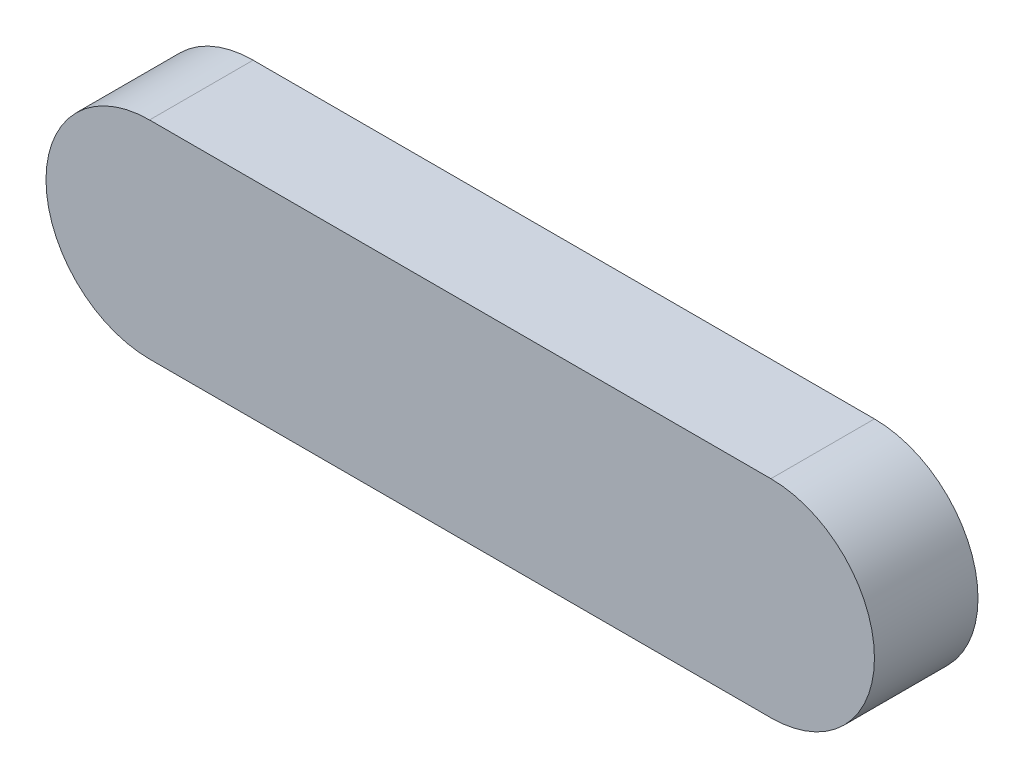
ISO-10303-21;
HEADER;
FILE_DESCRIPTION(('STEP AP214'),'2;1');
FILE_NAME('part.step','',(''),(''),'','','');
FILE_SCHEMA(('AUTOMOTIVE_DESIGN { 1 0 10303 214 1 1 1 1 }'));
ENDSEC;
DATA;
#1=APPLICATION_CONTEXT('core data for automotive mechanical design processes');
#2=APPLICATION_PROTOCOL_DEFINITION('international standard','automotive_design',2000,#1);
#3=PRODUCT_CONTEXT('',#1,'mechanical');
#4=PRODUCT('Part','Part','',(#3));
#5=PRODUCT_RELATED_PRODUCT_CATEGORY('part','',(#4));
#6=PRODUCT_DEFINITION_FORMATION('','',#4);
#7=PRODUCT_DEFINITION_CONTEXT('part definition',#1,'design');
#8=PRODUCT_DEFINITION('design','',#6,#7);
#9=PRODUCT_DEFINITION_SHAPE('','',#8);
#10=(LENGTH_UNIT() NAMED_UNIT(*) SI_UNIT(.MILLI.,.METRE.));
#11=(NAMED_UNIT(*) PLANE_ANGLE_UNIT() SI_UNIT($,.RADIAN.));
#12=(NAMED_UNIT(*) SI_UNIT($,.STERADIAN.) SOLID_ANGLE_UNIT());
#13=UNCERTAINTY_MEASURE_WITH_UNIT(LENGTH_MEASURE(1.E-05),#10,'distance_accuracy_value','');
#14=(GEOMETRIC_REPRESENTATION_CONTEXT(3) GLOBAL_UNCERTAINTY_ASSIGNED_CONTEXT((#13)) GLOBAL_UNIT_ASSIGNED_CONTEXT((#10,
#11,#12)) REPRESENTATION_CONTEXT('',''));
#15=CARTESIAN_POINT('',(0.,0.,0.));
#16=DIRECTION('',(0.,0.,1.));
#17=DIRECTION('',(1.,0.,0.));
#18=AXIS2_PLACEMENT_3D('',#15,#16,#17);
#19=CARTESIAN_POINT('',(0.,0.,10.));
#20=DIRECTION('',(0.,0.,-1.));
#21=DIRECTION('',(-1.,0.,0.));
#22=AXIS2_PLACEMENT_3D('',#19,#20,#21);
#23=CYLINDRICAL_SURFACE('',#22,10.);
#24=CARTESIAN_POINT('',(0.,0.,0.));
#25=DIRECTION('',(0.,0.,1.));
#26=DIRECTION('',(1.,0.,0.));
#27=AXIS2_PLACEMENT_3D('',#24,#25,#26);
#28=CIRCLE('',#27,10.);
#29=CARTESIAN_POINT('',(0.,10.,0.));
#30=VERTEX_POINT('',#29);
#31=CARTESIAN_POINT('',(0.,-10.,0.));
#32=VERTEX_POINT('',#31);
#33=EDGE_CURVE('E99',#30,#32,#28,.T.);
#34=ORIENTED_EDGE('',*,*,#33,.T.);
#35=DIRECTION('',(0.,0.,-1.));
#36=VECTOR('',#35,1.);
#37=CARTESIAN_POINT('',(0.,-10.,10.));
#38=LINE('',#37,#36);
#39=CARTESIAN_POINT('',(0.,-10.,10.));
#40=VERTEX_POINT('',#39);
#41=EDGE_CURVE('E11',#40,#32,#38,.T.);
#42=ORIENTED_EDGE('',*,*,#41,.F.);
#43=CARTESIAN_POINT('',(0.,0.,10.));
#44=DIRECTION('',(0.,0.,1.));
#45=DIRECTION('',(1.,0.,0.));
#46=AXIS2_PLACEMENT_3D('',#43,#44,#45);
#47=CIRCLE('',#46,10.);
#48=CARTESIAN_POINT('',(0.,10.,10.));
#49=VERTEX_POINT('',#48);
#50=EDGE_CURVE('E87',#49,#40,#47,.T.);
#51=ORIENTED_EDGE('',*,*,#50,.F.);
#52=DIRECTION('',(0.,0.,-1.));
#53=VECTOR('',#52,1.);
#54=CARTESIAN_POINT('',(0.,10.,10.));
#55=LINE('',#54,#53);
#56=EDGE_CURVE('E95',#49,#30,#55,.T.);
#57=ORIENTED_EDGE('',*,*,#56,.T.);
#58=EDGE_LOOP('',(#34,#42,#51,#57));
#59=FACE_BOUND('',#58,.T.);
#60=ADVANCED_FACE('F36',(#59),#23,.T.);
#61=CARTESIAN_POINT('',(0.,-10.,10.));
#62=DIRECTION('',(0.,1.,0.));
#63=DIRECTION('',(0.,0.,1.));
#64=AXIS2_PLACEMENT_3D('',#61,#62,#63);
#65=PLANE('',#64);
#66=DIRECTION('',(1.,0.,0.));
#67=VECTOR('',#66,1.);
#68=CARTESIAN_POINT('',(0.,-10.,0.));
#69=LINE('',#68,#67);
#70=CARTESIAN_POINT('',(60.,-10.,0.));
#71=VERTEX_POINT('',#70);
#72=EDGE_CURVE('E91',#32,#71,#69,.T.);
#73=ORIENTED_EDGE('',*,*,#72,.T.);
#74=DIRECTION('',(0.,0.,-1.));
#75=VECTOR('',#74,1.);
#76=CARTESIAN_POINT('',(60.,-10.,10.));
#77=LINE('',#76,#75);
#78=CARTESIAN_POINT('',(60.,-10.,10.));
#79=VERTEX_POINT('',#78);
#80=EDGE_CURVE('E44',#79,#71,#77,.T.);
#81=ORIENTED_EDGE('',*,*,#80,.F.);
#82=DIRECTION('',(1.,0.,0.));
#83=VECTOR('',#82,1.);
#84=CARTESIAN_POINT('',(0.,-10.,10.));
#85=LINE('',#84,#83);
#86=EDGE_CURVE('E82',#40,#79,#85,.T.);
#87=ORIENTED_EDGE('',*,*,#86,.F.);
#88=ORIENTED_EDGE('',*,*,#41,.T.);
#89=EDGE_LOOP('',(#73,#81,#87,#88));
#90=FACE_BOUND('',#89,.T.);
#91=ADVANCED_FACE('F90',(#90),#65,.F.);
#92=CARTESIAN_POINT('',(60.,0.,10.));
#93=DIRECTION('',(0.,0.,-1.));
#94=DIRECTION('',(-1.,0.,0.));
#95=AXIS2_PLACEMENT_3D('',#92,#93,#94);
#96=CYLINDRICAL_SURFACE('',#95,10.);
#97=CARTESIAN_POINT('',(60.,0.,0.));
#98=DIRECTION('',(0.,0.,1.));
#99=DIRECTION('',(1.,0.,0.));
#100=AXIS2_PLACEMENT_3D('',#97,#98,#99);
#101=CIRCLE('',#100,10.);
#102=CARTESIAN_POINT('',(60.,10.,0.));
#103=VERTEX_POINT('',#102);
#104=EDGE_CURVE('E69',#71,#103,#101,.T.);
#105=ORIENTED_EDGE('',*,*,#104,.T.);
#106=DIRECTION('',(0.,0.,-1.));
#107=VECTOR('',#106,1.);
#108=CARTESIAN_POINT('',(60.,10.,10.));
#109=LINE('',#108,#107);
#110=CARTESIAN_POINT('',(60.,10.,10.));
#111=VERTEX_POINT('',#110);
#112=EDGE_CURVE('E92',#111,#103,#109,.T.);
#113=ORIENTED_EDGE('',*,*,#112,.F.);
#114=CARTESIAN_POINT('',(60.,0.,10.));
#115=DIRECTION('',(0.,0.,1.));
#116=DIRECTION('',(1.,0.,0.));
#117=AXIS2_PLACEMENT_3D('',#114,#115,#116);
#118=CIRCLE('',#117,10.);
#119=EDGE_CURVE('E85',#79,#111,#118,.T.);
#120=ORIENTED_EDGE('',*,*,#119,.F.);
#121=ORIENTED_EDGE('',*,*,#80,.T.);
#122=EDGE_LOOP('',(#105,#113,#120,#121));
#123=FACE_BOUND('',#122,.T.);
#124=ADVANCED_FACE('F93',(#123),#96,.T.);
#125=CARTESIAN_POINT('',(0.,10.,10.));
#126=DIRECTION('',(0.,-1.,0.));
#127=DIRECTION('',(0.,0.,-1.));
#128=AXIS2_PLACEMENT_3D('',#125,#126,#127);
#129=PLANE('',#128);
#130=DIRECTION('',(-1.,0.,0.));
#131=VECTOR('',#130,1.);
#132=CARTESIAN_POINT('',(0.,10.,0.));
#133=LINE('',#132,#131);
#134=EDGE_CURVE('E75',#103,#30,#133,.T.);
#135=ORIENTED_EDGE('',*,*,#134,.T.);
#136=ORIENTED_EDGE('',*,*,#56,.F.);
#137=DIRECTION('',(-1.,0.,0.));
#138=VECTOR('',#137,1.);
#139=CARTESIAN_POINT('',(0.,10.,10.));
#140=LINE('',#139,#138);
#141=EDGE_CURVE('E52',#111,#49,#140,.T.);
#142=ORIENTED_EDGE('',*,*,#141,.F.);
#143=ORIENTED_EDGE('',*,*,#112,.T.);
#144=EDGE_LOOP('',(#135,#136,#142,#143));
#145=FACE_BOUND('',#144,.T.);
#146=ADVANCED_FACE('F106',(#145),#129,.F.);
#147=CARTESIAN_POINT('',(0.,0.,10.));
#148=DIRECTION('',(0.,0.,1.));
#149=DIRECTION('',(1.,0.,0.));
#150=AXIS2_PLACEMENT_3D('',#147,#148,#149);
#151=PLANE('',#150);
#152=ORIENTED_EDGE('',*,*,#50,.T.);
#153=ORIENTED_EDGE('',*,*,#86,.T.);
#154=ORIENTED_EDGE('',*,*,#119,.T.);
#155=ORIENTED_EDGE('',*,*,#141,.T.);
#156=EDGE_LOOP('',(#152,#153,#154,#155));
#157=FACE_BOUND('',#156,.T.);
#158=ADVANCED_FACE('F83',(#157),#151,.T.);
#159=CARTESIAN_POINT('',(0.,0.,0.));
#160=DIRECTION('',(0.,0.,1.));
#161=DIRECTION('',(1.,0.,0.));
#162=AXIS2_PLACEMENT_3D('',#159,#160,#161);
#163=PLANE('',#162);
#164=ORIENTED_EDGE('',*,*,#33,.F.);
#165=ORIENTED_EDGE('',*,*,#134,.F.);
#166=ORIENTED_EDGE('',*,*,#104,.F.);
#167=ORIENTED_EDGE('',*,*,#72,.F.);
#168=EDGE_LOOP('',(#164,#165,#166,#167));
#169=FACE_BOUND('',#168,.T.);
#170=ADVANCED_FACE('F109',(#169),#163,.F.);
#171=CLOSED_SHELL('',(#60,#91,#124,#146,#158,#170));
#172=MANIFOLD_SOLID_BREP('B2',#171);
#173=ADVANCED_BREP_SHAPE_REPRESENTATION('',(#18,#172),#14);
#174=SHAPE_DEFINITION_REPRESENTATION(#9,#173);
ENDSEC;
END-ISO-10303-21;
